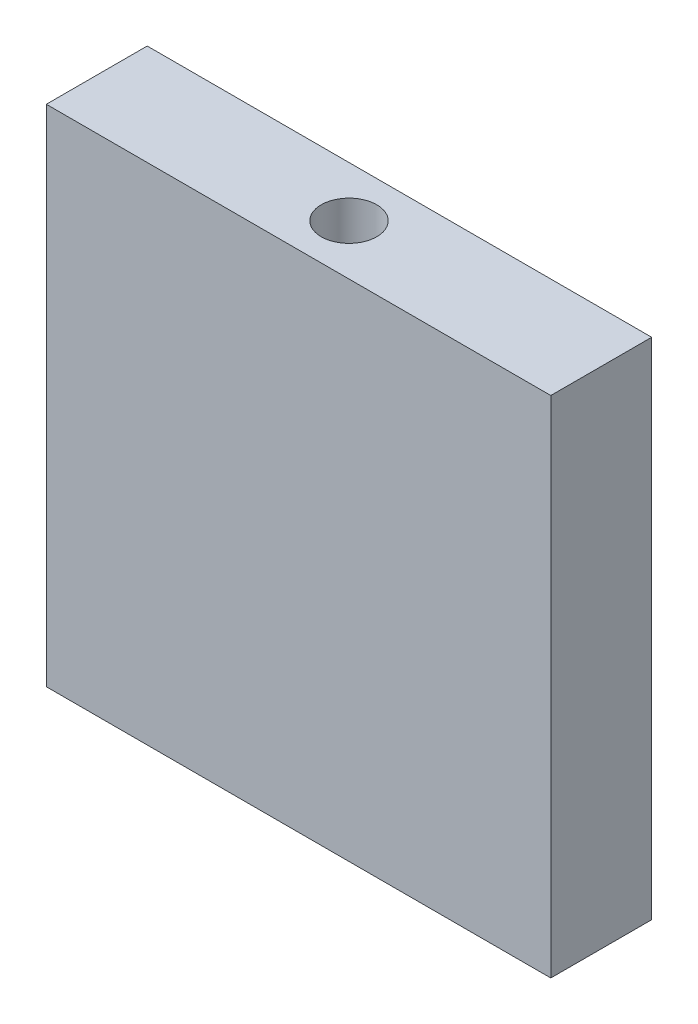
ISO-10303-21;
HEADER;
FILE_DESCRIPTION(('STEP AP214'),'2;1');
FILE_NAME('part.step','',(''),(''),'','','');
FILE_SCHEMA(('AUTOMOTIVE_DESIGN { 1 0 10303 214 1 1 1 1 }'));
ENDSEC;
DATA;
#1=APPLICATION_CONTEXT('core data for automotive mechanical design processes');
#2=APPLICATION_PROTOCOL_DEFINITION('international standard','automotive_design',2000,#1);
#3=PRODUCT_CONTEXT('',#1,'mechanical');
#4=PRODUCT('Part','Part','',(#3));
#5=PRODUCT_RELATED_PRODUCT_CATEGORY('part','',(#4));
#6=PRODUCT_DEFINITION_FORMATION('','',#4);
#7=PRODUCT_DEFINITION_CONTEXT('part definition',#1,'design');
#8=PRODUCT_DEFINITION('design','',#6,#7);
#9=PRODUCT_DEFINITION_SHAPE('','',#8);
#10=(LENGTH_UNIT() NAMED_UNIT(*) SI_UNIT(.MILLI.,.METRE.));
#11=(NAMED_UNIT(*) PLANE_ANGLE_UNIT() SI_UNIT($,.RADIAN.));
#12=(NAMED_UNIT(*) SI_UNIT($,.STERADIAN.) SOLID_ANGLE_UNIT());
#13=UNCERTAINTY_MEASURE_WITH_UNIT(LENGTH_MEASURE(1.E-05),#10,'distance_accuracy_value','');
#14=(GEOMETRIC_REPRESENTATION_CONTEXT(3) GLOBAL_UNCERTAINTY_ASSIGNED_CONTEXT((#13)) GLOBAL_UNIT_ASSIGNED_CONTEXT((#10,
#11,#12)) REPRESENTATION_CONTEXT('',''));
#15=CARTESIAN_POINT('',(0.,0.,0.));
#16=DIRECTION('',(0.,0.,1.));
#17=DIRECTION('',(1.,0.,0.));
#18=AXIS2_PLACEMENT_3D('',#15,#16,#17);
#19=CARTESIAN_POINT('',(-118.263473053892,100.,20.));
#20=DIRECTION('',(1.,0.,0.));
#21=DIRECTION('',(0.,0.,-1.));
#22=AXIS2_PLACEMENT_3D('',#19,#20,#21);
#23=PLANE('',#22);
#24=DIRECTION('',(0.,-1.,0.));
#25=VECTOR('',#24,1.);
#26=CARTESIAN_POINT('',(-118.263473053892,100.,0.));
#27=LINE('',#26,#25);
#28=CARTESIAN_POINT('',(-118.263473053892,100.,0.));
#29=VERTEX_POINT('',#28);
#30=CARTESIAN_POINT('',(-118.263473053892,0.,0.));
#31=VERTEX_POINT('',#30);
#32=EDGE_CURVE('E96',#29,#31,#27,.T.);
#33=ORIENTED_EDGE('',*,*,#32,.T.);
#34=DIRECTION('',(0.,0.,-1.));
#35=VECTOR('',#34,1.);
#36=CARTESIAN_POINT('',(-118.263473053892,0.,20.));
#37=LINE('',#36,#35);
#38=CARTESIAN_POINT('',(-118.263473053892,0.,20.));
#39=VERTEX_POINT('',#38);
#40=EDGE_CURVE('E11',#39,#31,#37,.T.);
#41=ORIENTED_EDGE('',*,*,#40,.F.);
#42=DIRECTION('',(0.,-1.,0.));
#43=VECTOR('',#42,1.);
#44=CARTESIAN_POINT('',(-118.263473053892,100.,20.));
#45=LINE('',#44,#43);
#46=CARTESIAN_POINT('',(-118.263473053892,100.,20.));
#47=VERTEX_POINT('',#46);
#48=EDGE_CURVE('E84',#47,#39,#45,.T.);
#49=ORIENTED_EDGE('',*,*,#48,.F.);
#50=DIRECTION('',(0.,0.,-1.));
#51=VECTOR('',#50,1.);
#52=CARTESIAN_POINT('',(-118.263473053892,100.,20.));
#53=LINE('',#52,#51);
#54=EDGE_CURVE('E92',#47,#29,#53,.T.);
#55=ORIENTED_EDGE('',*,*,#54,.T.);
#56=EDGE_LOOP('',(#33,#41,#49,#55));
#57=FACE_BOUND('',#56,.T.);
#58=ADVANCED_FACE('F33',(#57),#23,.F.);
#59=CARTESIAN_POINT('',(-118.263473053892,0.,20.));
#60=DIRECTION('',(0.,1.,0.));
#61=DIRECTION('',(0.,0.,1.));
#62=AXIS2_PLACEMENT_3D('',#59,#60,#61);
#63=PLANE('',#62);
#64=DIRECTION('',(1.,0.,0.));
#65=VECTOR('',#64,1.);
#66=CARTESIAN_POINT('',(-118.263473053892,0.,0.));
#67=LINE('',#66,#65);
#68=CARTESIAN_POINT('',(-18.2634730538921,0.,0.));
#69=VERTEX_POINT('',#68);
#70=EDGE_CURVE('E88',#31,#69,#67,.T.);
#71=ORIENTED_EDGE('',*,*,#70,.T.);
#72=DIRECTION('',(0.,0.,-1.));
#73=VECTOR('',#72,1.);
#74=CARTESIAN_POINT('',(-18.2634730538921,0.,20.));
#75=LINE('',#74,#73);
#76=CARTESIAN_POINT('',(-18.2634730538921,0.,20.));
#77=VERTEX_POINT('',#76);
#78=EDGE_CURVE('E41',#77,#69,#75,.T.);
#79=ORIENTED_EDGE('',*,*,#78,.F.);
#80=DIRECTION('',(1.,0.,0.));
#81=VECTOR('',#80,1.);
#82=CARTESIAN_POINT('',(-118.263473053892,0.,20.));
#83=LINE('',#82,#81);
#84=EDGE_CURVE('E79',#39,#77,#83,.T.);
#85=ORIENTED_EDGE('',*,*,#84,.F.);
#86=ORIENTED_EDGE('',*,*,#40,.T.);
#87=EDGE_LOOP('',(#71,#79,#85,#86));
#88=FACE_BOUND('',#87,.T.);
#89=ADVANCED_FACE('F87',(#88),#63,.F.);
#90=CARTESIAN_POINT('',(-18.2634730538922,100.,20.));
#91=DIRECTION('',(-1.,0.,0.));
#92=DIRECTION('',(0.,-1.,0.));
#93=AXIS2_PLACEMENT_3D('',#90,#91,#92);
#94=PLANE('',#93);
#95=DIRECTION('',(0.,1.,0.));
#96=VECTOR('',#95,1.);
#97=CARTESIAN_POINT('',(-18.2634730538922,100.,0.));
#98=LINE('',#97,#96);
#99=CARTESIAN_POINT('',(-18.2634730538922,100.,0.));
#100=VERTEX_POINT('',#99);
#101=EDGE_CURVE('E66',#69,#100,#98,.T.);
#102=ORIENTED_EDGE('',*,*,#101,.T.);
#103=DIRECTION('',(0.,0.,-1.));
#104=VECTOR('',#103,1.);
#105=CARTESIAN_POINT('',(-18.2634730538922,100.,20.));
#106=LINE('',#105,#104);
#107=CARTESIAN_POINT('',(-18.2634730538922,100.,20.));
#108=VERTEX_POINT('',#107);
#109=EDGE_CURVE('E89',#108,#100,#106,.T.);
#110=ORIENTED_EDGE('',*,*,#109,.F.);
#111=DIRECTION('',(0.,1.,0.));
#112=VECTOR('',#111,1.);
#113=CARTESIAN_POINT('',(-18.2634730538922,100.,20.));
#114=LINE('',#113,#112);
#115=EDGE_CURVE('E82',#77,#108,#114,.T.);
#116=ORIENTED_EDGE('',*,*,#115,.F.);
#117=ORIENTED_EDGE('',*,*,#78,.T.);
#118=EDGE_LOOP('',(#102,#110,#116,#117));
#119=FACE_BOUND('',#118,.T.);
#120=ADVANCED_FACE('F90',(#119),#94,.F.);
#121=CARTESIAN_POINT('',(-118.263473053892,100.,20.));
#122=DIRECTION('',(0.,-1.,0.));
#123=DIRECTION('',(0.,0.,-1.));
#124=AXIS2_PLACEMENT_3D('',#121,#122,#123);
#125=PLANE('',#124);
#126=CARTESIAN_POINT('',(-68.2634730538922,100.,10.));
#127=DIRECTION('',(0.,1.,0.));
#128=DIRECTION('',(0.,0.,1.));
#129=AXIS2_PLACEMENT_3D('',#126,#127,#128);
#130=CIRCLE('',#129,5.5);
#131=CARTESIAN_POINT('',(-68.2634730538922,100.,15.5));
#132=VERTEX_POINT('',#131);
#133=EDGE_CURVE('E110',#132,#132,#130,.T.);
#134=ORIENTED_EDGE('',*,*,#133,.F.);
#135=EDGE_LOOP('',(#134));
#136=FACE_BOUND('',#135,.T.);
#137=DIRECTION('',(-1.,0.,0.));
#138=VECTOR('',#137,1.);
#139=CARTESIAN_POINT('',(-118.263473053892,100.,0.));
#140=LINE('',#139,#138);
#141=EDGE_CURVE('E72',#100,#29,#140,.T.);
#142=ORIENTED_EDGE('',*,*,#141,.T.);
#143=ORIENTED_EDGE('',*,*,#54,.F.);
#144=DIRECTION('',(-1.,0.,0.));
#145=VECTOR('',#144,1.);
#146=CARTESIAN_POINT('',(-118.263473053892,100.,20.));
#147=LINE('',#146,#145);
#148=EDGE_CURVE('E49',#108,#47,#147,.T.);
#149=ORIENTED_EDGE('',*,*,#148,.F.);
#150=ORIENTED_EDGE('',*,*,#109,.T.);
#151=EDGE_LOOP('',(#142,#143,#149,#150));
#152=FACE_BOUND('',#151,.T.);
#153=ADVANCED_FACE('F104',(#136,#152),#125,.F.);
#154=CARTESIAN_POINT('',(0.,0.,20.));
#155=DIRECTION('',(0.,0.,1.));
#156=DIRECTION('',(1.,0.,0.));
#157=AXIS2_PLACEMENT_3D('',#154,#155,#156);
#158=PLANE('',#157);
#159=ORIENTED_EDGE('',*,*,#48,.T.);
#160=ORIENTED_EDGE('',*,*,#84,.T.);
#161=ORIENTED_EDGE('',*,*,#115,.T.);
#162=ORIENTED_EDGE('',*,*,#148,.T.);
#163=EDGE_LOOP('',(#159,#160,#161,#162));
#164=FACE_BOUND('',#163,.T.);
#165=ADVANCED_FACE('F80',(#164),#158,.T.);
#166=CARTESIAN_POINT('',(0.,0.,0.));
#167=DIRECTION('',(0.,0.,1.));
#168=DIRECTION('',(1.,0.,0.));
#169=AXIS2_PLACEMENT_3D('',#166,#167,#168);
#170=PLANE('',#169);
#171=ORIENTED_EDGE('',*,*,#32,.F.);
#172=ORIENTED_EDGE('',*,*,#141,.F.);
#173=ORIENTED_EDGE('',*,*,#101,.F.);
#174=ORIENTED_EDGE('',*,*,#70,.F.);
#175=EDGE_LOOP('',(#171,#172,#173,#174));
#176=FACE_BOUND('',#175,.T.);
#177=ADVANCED_FACE('F107',(#176),#170,.F.);
#178=CARTESIAN_POINT('',(-68.2634730538922,90.,10.));
#179=DIRECTION('',(0.,1.,0.));
#180=DIRECTION('',(0.,0.,1.));
#181=AXIS2_PLACEMENT_3D('',#178,#179,#180);
#182=CYLINDRICAL_SURFACE('',#181,5.5);
#183=CARTESIAN_POINT('',(-68.2634730538922,90.,10.));
#184=DIRECTION('',(0.,1.,0.));
#185=DIRECTION('',(0.,0.,1.));
#186=AXIS2_PLACEMENT_3D('',#183,#184,#185);
#187=CIRCLE('',#186,5.5);
#188=CARTESIAN_POINT('',(-68.2634730538922,90.,15.5));
#189=VERTEX_POINT('',#188);
#190=EDGE_CURVE('E99',#189,#189,#187,.T.);
#191=ORIENTED_EDGE('',*,*,#190,.F.);
#192=EDGE_LOOP('',(#191));
#193=FACE_BOUND('',#192,.T.);
#194=ORIENTED_EDGE('',*,*,#133,.T.);
#195=EDGE_LOOP('',(#194));
#196=FACE_BOUND('',#195,.T.);
#197=ADVANCED_FACE('F118',(#193,#196),#182,.F.);
#198=CARTESIAN_POINT('',(-68.2634730538922,90.,10.));
#199=DIRECTION('',(0.,1.,0.));
#200=DIRECTION('',(0.,0.,1.));
#201=AXIS2_PLACEMENT_3D('',#198,#199,#200);
#202=PLANE('',#201);
#203=ORIENTED_EDGE('',*,*,#190,.T.);
#204=EDGE_LOOP('',(#203));
#205=FACE_BOUND('',#204,.T.);
#206=ADVANCED_FACE('F116',(#205),#202,.T.);
#207=CLOSED_SHELL('',(#58,#89,#120,#153,#165,#177,#197,#206));
#208=MANIFOLD_SOLID_BREP('B2',#207);
#209=ADVANCED_BREP_SHAPE_REPRESENTATION('',(#18,#208),#14);
#210=SHAPE_DEFINITION_REPRESENTATION(#9,#209);
ENDSEC;
END-ISO-10303-21;
